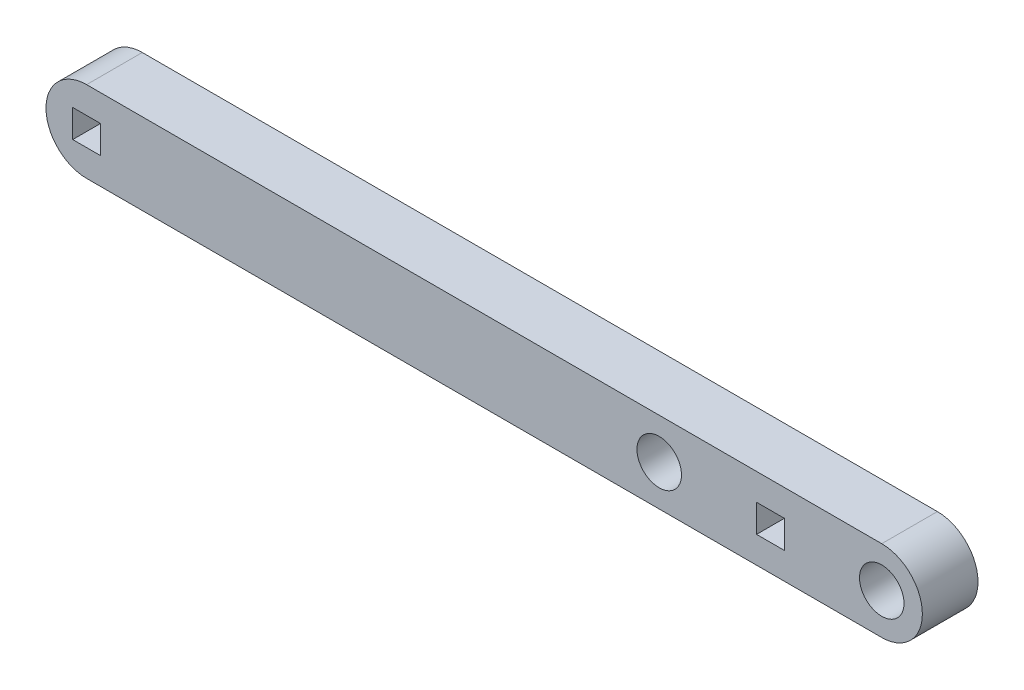
ISO-10303-21;
HEADER;
FILE_DESCRIPTION(('STEP AP214'),'2;1');
FILE_NAME('part.step','',(''),(''),'','','');
FILE_SCHEMA(('AUTOMOTIVE_DESIGN { 1 0 10303 214 1 1 1 1 }'));
ENDSEC;
DATA;
#1=APPLICATION_CONTEXT('core data for automotive mechanical design processes');
#2=APPLICATION_PROTOCOL_DEFINITION('international standard','automotive_design',2000,#1);
#3=PRODUCT_CONTEXT('',#1,'mechanical');
#4=PRODUCT('Part','Part','',(#3));
#5=PRODUCT_RELATED_PRODUCT_CATEGORY('part','',(#4));
#6=PRODUCT_DEFINITION_FORMATION('','',#4);
#7=PRODUCT_DEFINITION_CONTEXT('part definition',#1,'design');
#8=PRODUCT_DEFINITION('design','',#6,#7);
#9=PRODUCT_DEFINITION_SHAPE('','',#8);
#10=(LENGTH_UNIT() NAMED_UNIT(*) SI_UNIT(.MILLI.,.METRE.));
#11=(NAMED_UNIT(*) PLANE_ANGLE_UNIT() SI_UNIT($,.RADIAN.));
#12=(NAMED_UNIT(*) SI_UNIT($,.STERADIAN.) SOLID_ANGLE_UNIT());
#13=UNCERTAINTY_MEASURE_WITH_UNIT(LENGTH_MEASURE(1.E-05),#10,'distance_accuracy_value','');
#14=(GEOMETRIC_REPRESENTATION_CONTEXT(3) GLOBAL_UNCERTAINTY_ASSIGNED_CONTEXT((#13)) GLOBAL_UNIT_ASSIGNED_CONTEXT((#10,
#11,#12)) REPRESENTATION_CONTEXT('',''));
#15=CARTESIAN_POINT('',(0.,0.,0.));
#16=DIRECTION('',(0.,0.,1.));
#17=DIRECTION('',(1.,0.,0.));
#18=AXIS2_PLACEMENT_3D('',#15,#16,#17);
#19=CARTESIAN_POINT('',(0.,0.,6.35));
#20=DIRECTION('',(0.,0.,1.));
#21=DIRECTION('',(1.,0.,0.));
#22=AXIS2_PLACEMENT_3D('',#19,#20,#21);
#23=PLANE('',#22);
#24=CARTESIAN_POINT('',(90.7542,0.,6.35));
#25=DIRECTION('',(0.,0.,1.));
#26=DIRECTION('',(1.,0.,0.));
#27=AXIS2_PLACEMENT_3D('',#24,#25,#26);
#28=CIRCLE('',#27,2.54);
#29=CARTESIAN_POINT('',(93.2942,0.,6.35));
#30=VERTEX_POINT('',#29);
#31=EDGE_CURVE('E153',#30,#30,#28,.T.);
#32=ORIENTED_EDGE('',*,*,#31,.F.);
#33=EDGE_LOOP('',(#32));
#34=FACE_BOUND('',#33,.T.);
#35=CARTESIAN_POINT('',(0.,0.,6.35));
#36=DIRECTION('',(0.,0.,1.));
#37=DIRECTION('',(1.,0.,0.));
#38=AXIS2_PLACEMENT_3D('',#35,#36,#37);
#39=CIRCLE('',#38,4.63677530326498);
#40=CARTESIAN_POINT('',(0.,4.63677530326498,6.35));
#41=VERTEX_POINT('',#40);
#42=CARTESIAN_POINT('',(0.,-4.63677530326498,6.35));
#43=VERTEX_POINT('',#42);
#44=EDGE_CURVE('E194',#41,#43,#39,.T.);
#45=ORIENTED_EDGE('',*,*,#44,.T.);
#46=DIRECTION('',(1.,0.,0.));
#47=VECTOR('',#46,1.);
#48=CARTESIAN_POINT('',(0.,-4.63677530326498,6.35));
#49=LINE('',#48,#47);
#50=CARTESIAN_POINT('',(90.7542,-4.63677530326498,6.35));
#51=VERTEX_POINT('',#50);
#52=EDGE_CURVE('E197',#43,#51,#49,.T.);
#53=ORIENTED_EDGE('',*,*,#52,.T.);
#54=CARTESIAN_POINT('',(90.7542,0.,6.35));
#55=DIRECTION('',(0.,0.,1.));
#56=DIRECTION('',(1.,0.,0.));
#57=AXIS2_PLACEMENT_3D('',#54,#55,#56);
#58=CIRCLE('',#57,4.63677530326498);
#59=CARTESIAN_POINT('',(90.7542,4.63677530326498,6.35));
#60=VERTEX_POINT('',#59);
#61=EDGE_CURVE('E200',#51,#60,#58,.T.);
#62=ORIENTED_EDGE('',*,*,#61,.T.);
#63=DIRECTION('',(-1.,0.,0.));
#64=VECTOR('',#63,1.);
#65=CARTESIAN_POINT('',(0.,4.63677530326498,6.35));
#66=LINE('',#65,#64);
#67=EDGE_CURVE('E202',#60,#41,#66,.T.);
#68=ORIENTED_EDGE('',*,*,#67,.T.);
#69=EDGE_LOOP('',(#45,#53,#62,#68));
#70=FACE_BOUND('',#69,.T.);
#71=DIRECTION('',(-1.,0.,0.));
#72=VECTOR('',#71,1.);
#73=CARTESIAN_POINT('',(-1.5875,1.5875,6.35));
#74=LINE('',#73,#72);
#75=CARTESIAN_POINT('',(1.5875,1.5875,6.35));
#76=VERTEX_POINT('',#75);
#77=CARTESIAN_POINT('',(-1.5875,1.5875,6.35));
#78=VERTEX_POINT('',#77);
#79=EDGE_CURVE('E165',#76,#78,#74,.T.);
#80=ORIENTED_EDGE('',*,*,#79,.F.);
#81=DIRECTION('',(0.,1.,0.));
#82=VECTOR('',#81,1.);
#83=CARTESIAN_POINT('',(1.5875,-1.5875,6.35));
#84=LINE('',#83,#82);
#85=CARTESIAN_POINT('',(1.5875,-1.5875,6.35));
#86=VERTEX_POINT('',#85);
#87=EDGE_CURVE('E163',#86,#76,#84,.T.);
#88=ORIENTED_EDGE('',*,*,#87,.F.);
#89=DIRECTION('',(1.,0.,0.));
#90=VECTOR('',#89,1.);
#91=CARTESIAN_POINT('',(-1.5875,-1.5875,6.35));
#92=LINE('',#91,#90);
#93=CARTESIAN_POINT('',(-1.5875,-1.5875,6.35));
#94=VERTEX_POINT('',#93);
#95=EDGE_CURVE('E171',#94,#86,#92,.T.);
#96=ORIENTED_EDGE('',*,*,#95,.F.);
#97=DIRECTION('',(0.,-1.,0.));
#98=VECTOR('',#97,1.);
#99=CARTESIAN_POINT('',(-1.5875,-1.5875,6.35));
#100=LINE('',#99,#98);
#101=EDGE_CURVE('E168',#78,#94,#100,.T.);
#102=ORIENTED_EDGE('',*,*,#101,.F.);
#103=EDGE_LOOP('',(#80,#88,#96,#102));
#104=FACE_BOUND('',#103,.T.);
#105=DIRECTION('',(-1.,0.,0.));
#106=VECTOR('',#105,1.);
#107=CARTESIAN_POINT('',(76.4667000000002,1.58749999999999,6.35));
#108=LINE('',#107,#106);
#109=CARTESIAN_POINT('',(79.6417,1.5875,6.35));
#110=VERTEX_POINT('',#109);
#111=CARTESIAN_POINT('',(76.4667000000002,1.58749999999999,6.35));
#112=VERTEX_POINT('',#111);
#113=EDGE_CURVE('E132',#110,#112,#108,.T.);
#114=ORIENTED_EDGE('',*,*,#113,.F.);
#115=DIRECTION('',(0.,1.,0.));
#116=VECTOR('',#115,1.);
#117=CARTESIAN_POINT('',(79.6417,-1.5875,6.35));
#118=LINE('',#117,#116);
#119=CARTESIAN_POINT('',(79.6417,-1.5875,6.35));
#120=VERTEX_POINT('',#119);
#121=EDGE_CURVE('E124',#120,#110,#118,.T.);
#122=ORIENTED_EDGE('',*,*,#121,.F.);
#123=DIRECTION('',(1.,0.,0.));
#124=VECTOR('',#123,1.);
#125=CARTESIAN_POINT('',(76.4667,-1.5875,6.35));
#126=LINE('',#125,#124);
#127=CARTESIAN_POINT('',(76.4667,-1.5875,6.35));
#128=VERTEX_POINT('',#127);
#129=EDGE_CURVE('E147',#128,#120,#126,.T.);
#130=ORIENTED_EDGE('',*,*,#129,.F.);
#131=DIRECTION('',(0.,-1.,0.));
#132=VECTOR('',#131,1.);
#133=CARTESIAN_POINT('',(76.4667,-1.5875,6.35));
#134=LINE('',#133,#132);
#135=EDGE_CURVE('E145',#112,#128,#134,.T.);
#136=ORIENTED_EDGE('',*,*,#135,.F.);
#137=EDGE_LOOP('',(#114,#122,#130,#136));
#138=FACE_BOUND('',#137,.T.);
#139=CARTESIAN_POINT('',(65.3542,0.,6.35));
#140=DIRECTION('',(0.,0.,1.));
#141=DIRECTION('',(1.,0.,0.));
#142=AXIS2_PLACEMENT_3D('',#139,#140,#141);
#143=CIRCLE('',#142,2.54);
#144=CARTESIAN_POINT('',(67.8942,0.,6.35));
#145=VERTEX_POINT('',#144);
#146=EDGE_CURVE('E311',#145,#145,#143,.T.);
#147=ORIENTED_EDGE('',*,*,#146,.F.);
#148=EDGE_LOOP('',(#147));
#149=FACE_BOUND('',#148,.T.);
#150=ADVANCED_FACE('F35',(#34,#70,#104,#138,#149),#23,.T.);
#151=CARTESIAN_POINT('',(0.,0.,0.));
#152=DIRECTION('',(0.,0.,1.));
#153=DIRECTION('',(1.,0.,0.));
#154=AXIS2_PLACEMENT_3D('',#151,#152,#153);
#155=PLANE('',#154);
#156=DIRECTION('',(0.,1.,0.));
#157=VECTOR('',#156,1.);
#158=CARTESIAN_POINT('',(1.5875,-1.5875,0.));
#159=LINE('',#158,#157);
#160=CARTESIAN_POINT('',(1.5875,-1.5875,0.));
#161=VERTEX_POINT('',#160);
#162=CARTESIAN_POINT('',(1.5875,1.5875,0.));
#163=VERTEX_POINT('',#162);
#164=EDGE_CURVE('E140',#161,#163,#159,.T.);
#165=ORIENTED_EDGE('',*,*,#164,.T.);
#166=DIRECTION('',(-1.,0.,0.));
#167=VECTOR('',#166,1.);
#168=CARTESIAN_POINT('',(-1.5875,1.5875,0.));
#169=LINE('',#168,#167);
#170=CARTESIAN_POINT('',(-1.5875,1.5875,0.));
#171=VERTEX_POINT('',#170);
#172=EDGE_CURVE('E176',#163,#171,#169,.T.);
#173=ORIENTED_EDGE('',*,*,#172,.T.);
#174=DIRECTION('',(0.,-1.,0.));
#175=VECTOR('',#174,1.);
#176=CARTESIAN_POINT('',(-1.5875,-1.5875,0.));
#177=LINE('',#176,#175);
#178=CARTESIAN_POINT('',(-1.5875,-1.5875,0.));
#179=VERTEX_POINT('',#178);
#180=EDGE_CURVE('E179',#171,#179,#177,.T.);
#181=ORIENTED_EDGE('',*,*,#180,.T.);
#182=DIRECTION('',(1.,0.,0.));
#183=VECTOR('',#182,1.);
#184=CARTESIAN_POINT('',(-1.5875,-1.5875,0.));
#185=LINE('',#184,#183);
#186=EDGE_CURVE('E166',#179,#161,#185,.T.);
#187=ORIENTED_EDGE('',*,*,#186,.T.);
#188=EDGE_LOOP('',(#165,#173,#181,#187));
#189=FACE_BOUND('',#188,.T.);
#190=CARTESIAN_POINT('',(0.,0.,0.));
#191=DIRECTION('',(0.,0.,1.));
#192=DIRECTION('',(1.,0.,0.));
#193=AXIS2_PLACEMENT_3D('',#190,#191,#192);
#194=CIRCLE('',#193,4.63677530326498);
#195=CARTESIAN_POINT('',(0.,4.63677530326498,0.));
#196=VERTEX_POINT('',#195);
#197=CARTESIAN_POINT('',(0.,-4.63677530326498,0.));
#198=VERTEX_POINT('',#197);
#199=EDGE_CURVE('E193',#196,#198,#194,.T.);
#200=ORIENTED_EDGE('',*,*,#199,.F.);
#201=DIRECTION('',(-1.,0.,0.));
#202=VECTOR('',#201,1.);
#203=CARTESIAN_POINT('',(0.,4.63677530326498,0.));
#204=LINE('',#203,#202);
#205=CARTESIAN_POINT('',(90.7542,4.63677530326498,0.));
#206=VERTEX_POINT('',#205);
#207=EDGE_CURVE('E198',#206,#196,#204,.T.);
#208=ORIENTED_EDGE('',*,*,#207,.F.);
#209=CARTESIAN_POINT('',(90.7542,0.,0.));
#210=DIRECTION('',(0.,0.,1.));
#211=DIRECTION('',(1.,0.,0.));
#212=AXIS2_PLACEMENT_3D('',#209,#210,#211);
#213=CIRCLE('',#212,4.63677530326498);
#214=CARTESIAN_POINT('',(90.7542,-4.63677530326498,0.));
#215=VERTEX_POINT('',#214);
#216=EDGE_CURVE('E209',#215,#206,#213,.T.);
#217=ORIENTED_EDGE('',*,*,#216,.F.);
#218=DIRECTION('',(1.,0.,0.));
#219=VECTOR('',#218,1.);
#220=CARTESIAN_POINT('',(0.,-4.63677530326498,0.));
#221=LINE('',#220,#219);
#222=EDGE_CURVE('E207',#198,#215,#221,.T.);
#223=ORIENTED_EDGE('',*,*,#222,.F.);
#224=EDGE_LOOP('',(#200,#208,#217,#223));
#225=FACE_BOUND('',#224,.T.);
#226=DIRECTION('',(0.,1.,0.));
#227=VECTOR('',#226,1.);
#228=CARTESIAN_POINT('',(79.6417,-1.5875,0.));
#229=LINE('',#228,#227);
#230=CARTESIAN_POINT('',(79.6417,-1.5875,0.));
#231=VERTEX_POINT('',#230);
#232=CARTESIAN_POINT('',(79.6417,1.5875,0.));
#233=VERTEX_POINT('',#232);
#234=EDGE_CURVE('E58',#231,#233,#229,.T.);
#235=ORIENTED_EDGE('',*,*,#234,.T.);
#236=DIRECTION('',(-1.,0.,0.));
#237=VECTOR('',#236,1.);
#238=CARTESIAN_POINT('',(76.4667000000002,1.58749999999999,0.));
#239=LINE('',#238,#237);
#240=CARTESIAN_POINT('',(76.4667000000002,1.58749999999999,0.));
#241=VERTEX_POINT('',#240);
#242=EDGE_CURVE('E139',#233,#241,#239,.T.);
#243=ORIENTED_EDGE('',*,*,#242,.T.);
#244=DIRECTION('',(0.,-1.,0.));
#245=VECTOR('',#244,1.);
#246=CARTESIAN_POINT('',(76.4667,-1.5875,0.));
#247=LINE('',#246,#245);
#248=CARTESIAN_POINT('',(76.4667,-1.5875,0.));
#249=VERTEX_POINT('',#248);
#250=EDGE_CURVE('E155',#241,#249,#247,.T.);
#251=ORIENTED_EDGE('',*,*,#250,.T.);
#252=DIRECTION('',(1.,0.,0.));
#253=VECTOR('',#252,1.);
#254=CARTESIAN_POINT('',(76.4667,-1.5875,0.));
#255=LINE('',#254,#253);
#256=EDGE_CURVE('E133',#249,#231,#255,.T.);
#257=ORIENTED_EDGE('',*,*,#256,.T.);
#258=EDGE_LOOP('',(#235,#243,#251,#257));
#259=FACE_BOUND('',#258,.T.);
#260=CARTESIAN_POINT('',(90.7542,0.,0.));
#261=DIRECTION('',(0.,0.,1.));
#262=DIRECTION('',(1.,0.,0.));
#263=AXIS2_PLACEMENT_3D('',#260,#261,#262);
#264=CIRCLE('',#263,2.54);
#265=CARTESIAN_POINT('',(93.2942,0.,0.));
#266=VERTEX_POINT('',#265);
#267=EDGE_CURVE('E317',#266,#266,#264,.T.);
#268=ORIENTED_EDGE('',*,*,#267,.T.);
#269=EDGE_LOOP('',(#268));
#270=FACE_BOUND('',#269,.T.);
#271=CARTESIAN_POINT('',(65.3542,0.,0.));
#272=DIRECTION('',(0.,0.,1.));
#273=DIRECTION('',(1.,0.,0.));
#274=AXIS2_PLACEMENT_3D('',#271,#272,#273);
#275=CIRCLE('',#274,2.54);
#276=CARTESIAN_POINT('',(67.8942,0.,0.));
#277=VERTEX_POINT('',#276);
#278=EDGE_CURVE('E314',#277,#277,#275,.T.);
#279=ORIENTED_EDGE('',*,*,#278,.T.);
#280=EDGE_LOOP('',(#279));
#281=FACE_BOUND('',#280,.T.);
#282=ADVANCED_FACE('F227',(#189,#225,#259,#270,#281),#155,.F.);
#283=CARTESIAN_POINT('',(0.,0.,6.35));
#284=DIRECTION('',(0.,0.,-1.));
#285=DIRECTION('',(-1.,0.,0.));
#286=AXIS2_PLACEMENT_3D('',#283,#284,#285);
#287=CYLINDRICAL_SURFACE('',#286,4.63677530326498);
#288=ORIENTED_EDGE('',*,*,#199,.T.);
#289=DIRECTION('',(0.,0.,-1.));
#290=VECTOR('',#289,1.);
#291=CARTESIAN_POINT('',(0.,-4.63677530326498,6.35));
#292=LINE('',#291,#290);
#293=EDGE_CURVE('E11',#43,#198,#292,.T.);
#294=ORIENTED_EDGE('',*,*,#293,.F.);
#295=ORIENTED_EDGE('',*,*,#44,.F.);
#296=DIRECTION('',(0.,0.,-1.));
#297=VECTOR('',#296,1.);
#298=CARTESIAN_POINT('',(0.,4.63677530326498,6.35));
#299=LINE('',#298,#297);
#300=EDGE_CURVE('E204',#41,#196,#299,.T.);
#301=ORIENTED_EDGE('',*,*,#300,.T.);
#302=EDGE_LOOP('',(#288,#294,#295,#301));
#303=FACE_BOUND('',#302,.T.);
#304=ADVANCED_FACE('F37',(#303),#287,.T.);
#305=CARTESIAN_POINT('',(0.,-4.63677530326498,6.35));
#306=DIRECTION('',(0.,1.,0.));
#307=DIRECTION('',(0.,0.,1.));
#308=AXIS2_PLACEMENT_3D('',#305,#306,#307);
#309=PLANE('',#308);
#310=ORIENTED_EDGE('',*,*,#222,.T.);
#311=DIRECTION('',(0.,0.,-1.));
#312=VECTOR('',#311,1.);
#313=CARTESIAN_POINT('',(90.7542,-4.63677530326498,6.35));
#314=LINE('',#313,#312);
#315=EDGE_CURVE('E43',#51,#215,#314,.T.);
#316=ORIENTED_EDGE('',*,*,#315,.F.);
#317=ORIENTED_EDGE('',*,*,#52,.F.);
#318=ORIENTED_EDGE('',*,*,#293,.T.);
#319=EDGE_LOOP('',(#310,#316,#317,#318));
#320=FACE_BOUND('',#319,.T.);
#321=ADVANCED_FACE('F238',(#320),#309,.F.);
#322=CARTESIAN_POINT('',(90.7542,0.,6.35));
#323=DIRECTION('',(0.,0.,-1.));
#324=DIRECTION('',(-1.,0.,0.));
#325=AXIS2_PLACEMENT_3D('',#322,#323,#324);
#326=CYLINDRICAL_SURFACE('',#325,4.63677530326498);
#327=ORIENTED_EDGE('',*,*,#216,.T.);
#328=DIRECTION('',(0.,0.,-1.));
#329=VECTOR('',#328,1.);
#330=CARTESIAN_POINT('',(90.7542,4.63677530326498,6.35));
#331=LINE('',#330,#329);
#332=EDGE_CURVE('E214',#60,#206,#331,.T.);
#333=ORIENTED_EDGE('',*,*,#332,.F.);
#334=ORIENTED_EDGE('',*,*,#61,.F.);
#335=ORIENTED_EDGE('',*,*,#315,.T.);
#336=EDGE_LOOP('',(#327,#333,#334,#335));
#337=FACE_BOUND('',#336,.T.);
#338=ADVANCED_FACE('F221',(#337),#326,.T.);
#339=CARTESIAN_POINT('',(0.,4.63677530326498,6.35));
#340=DIRECTION('',(0.,-1.,0.));
#341=DIRECTION('',(0.,0.,-1.));
#342=AXIS2_PLACEMENT_3D('',#339,#340,#341);
#343=PLANE('',#342);
#344=ORIENTED_EDGE('',*,*,#207,.T.);
#345=ORIENTED_EDGE('',*,*,#300,.F.);
#346=ORIENTED_EDGE('',*,*,#67,.F.);
#347=ORIENTED_EDGE('',*,*,#332,.T.);
#348=EDGE_LOOP('',(#344,#345,#346,#347));
#349=FACE_BOUND('',#348,.T.);
#350=ADVANCED_FACE('F231',(#349),#343,.F.);
#351=CARTESIAN_POINT('',(1.5875,-1.5875,6.35));
#352=DIRECTION('',(-1.,0.,0.));
#353=DIRECTION('',(0.,0.,1.));
#354=AXIS2_PLACEMENT_3D('',#351,#352,#353);
#355=PLANE('',#354);
#356=ORIENTED_EDGE('',*,*,#164,.F.);
#357=DIRECTION('',(0.,0.,-1.));
#358=VECTOR('',#357,1.);
#359=CARTESIAN_POINT('',(1.5875,-1.5875,6.35));
#360=LINE('',#359,#358);
#361=EDGE_CURVE('E173',#86,#161,#360,.T.);
#362=ORIENTED_EDGE('',*,*,#361,.F.);
#363=ORIENTED_EDGE('',*,*,#87,.T.);
#364=DIRECTION('',(0.,0.,-1.));
#365=VECTOR('',#364,1.);
#366=CARTESIAN_POINT('',(1.5875,1.5875,6.35));
#367=LINE('',#366,#365);
#368=EDGE_CURVE('E190',#76,#163,#367,.T.);
#369=ORIENTED_EDGE('',*,*,#368,.T.);
#370=EDGE_LOOP('',(#356,#362,#363,#369));
#371=FACE_BOUND('',#370,.T.);
#372=ADVANCED_FACE('F255',(#371),#355,.T.);
#373=CARTESIAN_POINT('',(-1.5875,1.5875,6.35));
#374=DIRECTION('',(0.,-1.,0.));
#375=DIRECTION('',(0.,0.,-1.));
#376=AXIS2_PLACEMENT_3D('',#373,#374,#375);
#377=PLANE('',#376);
#378=ORIENTED_EDGE('',*,*,#172,.F.);
#379=ORIENTED_EDGE('',*,*,#368,.F.);
#380=ORIENTED_EDGE('',*,*,#79,.T.);
#381=DIRECTION('',(0.,0.,-1.));
#382=VECTOR('',#381,1.);
#383=CARTESIAN_POINT('',(-1.5875,1.5875,6.35));
#384=LINE('',#383,#382);
#385=EDGE_CURVE('E188',#78,#171,#384,.T.);
#386=ORIENTED_EDGE('',*,*,#385,.T.);
#387=EDGE_LOOP('',(#378,#379,#380,#386));
#388=FACE_BOUND('',#387,.T.);
#389=ADVANCED_FACE('F262',(#388),#377,.T.);
#390=CARTESIAN_POINT('',(-1.5875,-1.5875,6.35));
#391=DIRECTION('',(1.,0.,0.));
#392=DIRECTION('',(0.,0.,-1.));
#393=AXIS2_PLACEMENT_3D('',#390,#391,#392);
#394=PLANE('',#393);
#395=ORIENTED_EDGE('',*,*,#180,.F.);
#396=ORIENTED_EDGE('',*,*,#385,.F.);
#397=ORIENTED_EDGE('',*,*,#101,.T.);
#398=DIRECTION('',(0.,0.,-1.));
#399=VECTOR('',#398,1.);
#400=CARTESIAN_POINT('',(-1.5875,-1.5875,6.35));
#401=LINE('',#400,#399);
#402=EDGE_CURVE('E186',#94,#179,#401,.T.);
#403=ORIENTED_EDGE('',*,*,#402,.T.);
#404=EDGE_LOOP('',(#395,#396,#397,#403));
#405=FACE_BOUND('',#404,.T.);
#406=ADVANCED_FACE('F267',(#405),#394,.T.);
#407=CARTESIAN_POINT('',(-1.5875,-1.5875,6.35));
#408=DIRECTION('',(0.,1.,0.));
#409=DIRECTION('',(0.,0.,1.));
#410=AXIS2_PLACEMENT_3D('',#407,#408,#409);
#411=PLANE('',#410);
#412=ORIENTED_EDGE('',*,*,#186,.F.);
#413=ORIENTED_EDGE('',*,*,#402,.F.);
#414=ORIENTED_EDGE('',*,*,#95,.T.);
#415=ORIENTED_EDGE('',*,*,#361,.T.);
#416=EDGE_LOOP('',(#412,#413,#414,#415));
#417=FACE_BOUND('',#416,.T.);
#418=ADVANCED_FACE('F274',(#417),#411,.T.);
#419=CARTESIAN_POINT('',(79.6417,-1.5875,6.35));
#420=DIRECTION('',(-1.,0.,0.));
#421=DIRECTION('',(0.,0.,1.));
#422=AXIS2_PLACEMENT_3D('',#419,#420,#421);
#423=PLANE('',#422);
#424=ORIENTED_EDGE('',*,*,#234,.F.);
#425=DIRECTION('',(0.,0.,-1.));
#426=VECTOR('',#425,1.);
#427=CARTESIAN_POINT('',(79.6417,-1.5875,6.35));
#428=LINE('',#427,#426);
#429=EDGE_CURVE('E128',#120,#231,#428,.T.);
#430=ORIENTED_EDGE('',*,*,#429,.F.);
#431=ORIENTED_EDGE('',*,*,#121,.T.);
#432=DIRECTION('',(0.,0.,-1.));
#433=VECTOR('',#432,1.);
#434=CARTESIAN_POINT('',(79.6417,1.5875,6.35));
#435=LINE('',#434,#433);
#436=EDGE_CURVE('E127',#110,#233,#435,.T.);
#437=ORIENTED_EDGE('',*,*,#436,.T.);
#438=EDGE_LOOP('',(#424,#430,#431,#437));
#439=FACE_BOUND('',#438,.T.);
#440=ADVANCED_FACE('F126',(#439),#423,.T.);
#441=CARTESIAN_POINT('',(76.4667000000002,1.58749999999999,6.35));
#442=DIRECTION('',(0.,-1.,0.));
#443=DIRECTION('',(1.,0.,0.));
#444=AXIS2_PLACEMENT_3D('',#441,#442,#443);
#445=PLANE('',#444);
#446=ORIENTED_EDGE('',*,*,#242,.F.);
#447=ORIENTED_EDGE('',*,*,#436,.F.);
#448=ORIENTED_EDGE('',*,*,#113,.T.);
#449=DIRECTION('',(0.,0.,-1.));
#450=VECTOR('',#449,1.);
#451=CARTESIAN_POINT('',(76.4667000000002,1.58749999999999,6.35));
#452=LINE('',#451,#450);
#453=EDGE_CURVE('E141',#112,#241,#452,.T.);
#454=ORIENTED_EDGE('',*,*,#453,.T.);
#455=EDGE_LOOP('',(#446,#447,#448,#454));
#456=FACE_BOUND('',#455,.T.);
#457=ADVANCED_FACE('F136',(#456),#445,.T.);
#458=CARTESIAN_POINT('',(76.4667,-1.5875,6.35));
#459=DIRECTION('',(1.,0.,0.));
#460=DIRECTION('',(0.,1.,0.));
#461=AXIS2_PLACEMENT_3D('',#458,#459,#460);
#462=PLANE('',#461);
#463=ORIENTED_EDGE('',*,*,#250,.F.);
#464=ORIENTED_EDGE('',*,*,#453,.F.);
#465=ORIENTED_EDGE('',*,*,#135,.T.);
#466=DIRECTION('',(0.,0.,-1.));
#467=VECTOR('',#466,1.);
#468=CARTESIAN_POINT('',(76.4667,-1.5875,6.35));
#469=LINE('',#468,#467);
#470=EDGE_CURVE('E50',#128,#249,#469,.T.);
#471=ORIENTED_EDGE('',*,*,#470,.T.);
#472=EDGE_LOOP('',(#463,#464,#465,#471));
#473=FACE_BOUND('',#472,.T.);
#474=ADVANCED_FACE('F292',(#473),#462,.T.);
#475=CARTESIAN_POINT('',(76.4667,-1.5875,6.35));
#476=DIRECTION('',(0.,1.,0.));
#477=DIRECTION('',(0.,0.,1.));
#478=AXIS2_PLACEMENT_3D('',#475,#476,#477);
#479=PLANE('',#478);
#480=ORIENTED_EDGE('',*,*,#256,.F.);
#481=ORIENTED_EDGE('',*,*,#470,.F.);
#482=ORIENTED_EDGE('',*,*,#129,.T.);
#483=ORIENTED_EDGE('',*,*,#429,.T.);
#484=EDGE_LOOP('',(#480,#481,#482,#483));
#485=FACE_BOUND('',#484,.T.);
#486=ADVANCED_FACE('F295',(#485),#479,.T.);
#487=CARTESIAN_POINT('',(90.7542,0.,6.35));
#488=DIRECTION('',(0.,0.,-1.));
#489=DIRECTION('',(-1.,0.,0.));
#490=AXIS2_PLACEMENT_3D('',#487,#488,#489);
#491=CYLINDRICAL_SURFACE('',#490,2.54);
#492=ORIENTED_EDGE('',*,*,#31,.T.);
#493=EDGE_LOOP('',(#492));
#494=FACE_BOUND('',#493,.T.);
#495=ORIENTED_EDGE('',*,*,#267,.F.);
#496=EDGE_LOOP('',(#495));
#497=FACE_BOUND('',#496,.T.);
#498=ADVANCED_FACE('F299',(#494,#497),#491,.F.);
#499=CARTESIAN_POINT('',(65.3542,0.,6.35));
#500=DIRECTION('',(0.,0.,-1.));
#501=DIRECTION('',(-1.,0.,0.));
#502=AXIS2_PLACEMENT_3D('',#499,#500,#501);
#503=CYLINDRICAL_SURFACE('',#502,2.54);
#504=ORIENTED_EDGE('',*,*,#146,.T.);
#505=EDGE_LOOP('',(#504));
#506=FACE_BOUND('',#505,.T.);
#507=ORIENTED_EDGE('',*,*,#278,.F.);
#508=EDGE_LOOP('',(#507));
#509=FACE_BOUND('',#508,.T.);
#510=ADVANCED_FACE('F302',(#506,#509),#503,.F.);
#511=CLOSED_SHELL('',(#150,#282,#304,#321,#338,#350,#372,#389,#406,#418,#440,#457,#474,#486,
#498,#510));
#512=MANIFOLD_SOLID_BREP('B2',#511);
#513=ADVANCED_BREP_SHAPE_REPRESENTATION('',(#18,#512),#14);
#514=SHAPE_DEFINITION_REPRESENTATION(#9,#513);
ENDSEC;
END-ISO-10303-21;
